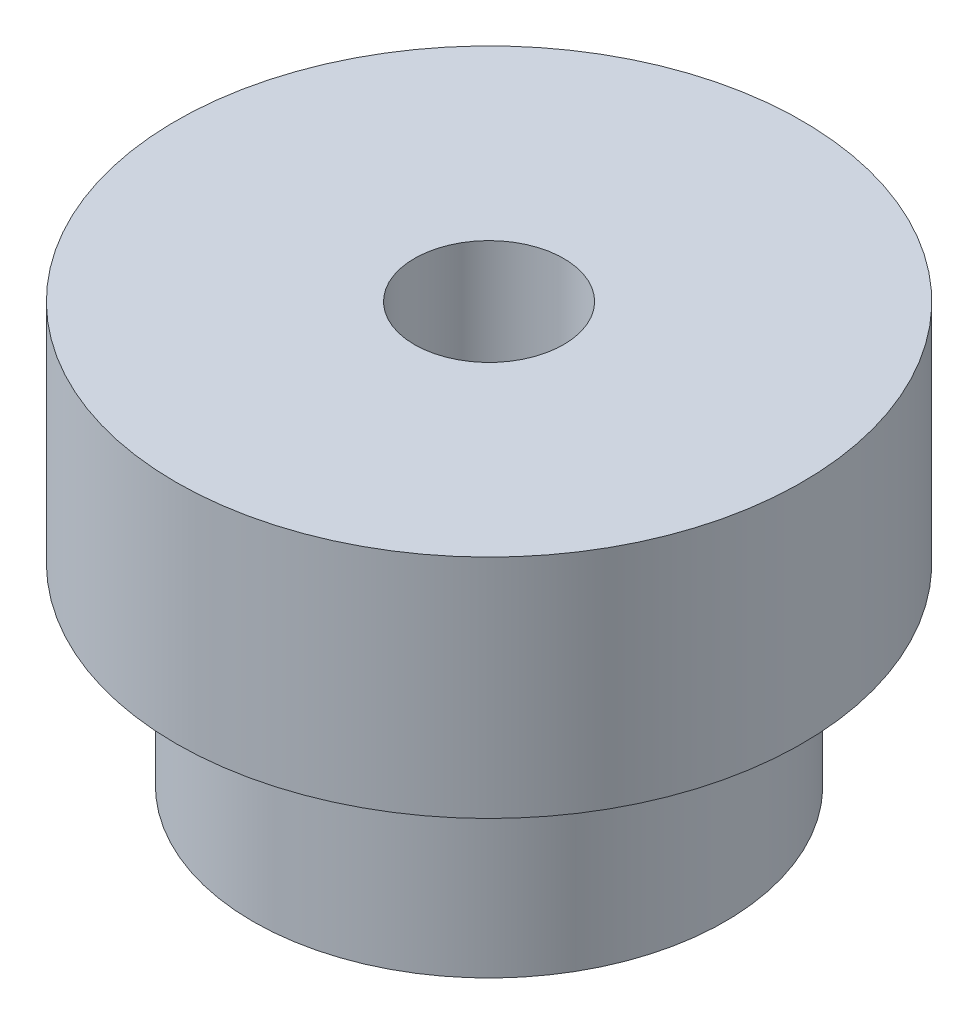
ISO-10303-21;
HEADER;
FILE_DESCRIPTION(('STEP AP214'),'2;1');
FILE_NAME('part.step','',(''),(''),'','','');
FILE_SCHEMA(('AUTOMOTIVE_DESIGN { 1 0 10303 214 1 1 1 1 }'));
ENDSEC;
DATA;
#1=APPLICATION_CONTEXT('core data for automotive mechanical design processes');
#2=APPLICATION_PROTOCOL_DEFINITION('international standard','automotive_design',2000,#1);
#3=PRODUCT_CONTEXT('',#1,'mechanical');
#4=PRODUCT('Part','Part','',(#3));
#5=PRODUCT_RELATED_PRODUCT_CATEGORY('part','',(#4));
#6=PRODUCT_DEFINITION_FORMATION('','',#4);
#7=PRODUCT_DEFINITION_CONTEXT('part definition',#1,'design');
#8=PRODUCT_DEFINITION('design','',#6,#7);
#9=PRODUCT_DEFINITION_SHAPE('','',#8);
#10=(LENGTH_UNIT() NAMED_UNIT(*) SI_UNIT(.MILLI.,.METRE.));
#11=(NAMED_UNIT(*) PLANE_ANGLE_UNIT() SI_UNIT($,.RADIAN.));
#12=(NAMED_UNIT(*) SI_UNIT($,.STERADIAN.) SOLID_ANGLE_UNIT());
#13=UNCERTAINTY_MEASURE_WITH_UNIT(LENGTH_MEASURE(1.E-05),#10,'distance_accuracy_value','');
#14=(GEOMETRIC_REPRESENTATION_CONTEXT(3) GLOBAL_UNCERTAINTY_ASSIGNED_CONTEXT((#13)) GLOBAL_UNIT_ASSIGNED_CONTEXT((#10,
#11,#12)) REPRESENTATION_CONTEXT('',''));
#15=CARTESIAN_POINT('',(0.,0.,0.));
#16=DIRECTION('',(0.,0.,1.));
#17=DIRECTION('',(1.,0.,0.));
#18=AXIS2_PLACEMENT_3D('',#15,#16,#17);
#19=CARTESIAN_POINT('',(0.,10.16,0.));
#20=DIRECTION('',(0.,-1.,0.));
#21=DIRECTION('',(0.,0.,-1.));
#22=AXIS2_PLACEMENT_3D('',#19,#20,#21);
#23=CYLINDRICAL_SURFACE('',#22,12.446);
#24=CARTESIAN_POINT('',(0.,10.16,0.));
#25=DIRECTION('',(0.,1.,0.));
#26=DIRECTION('',(0.,0.,1.));
#27=AXIS2_PLACEMENT_3D('',#24,#25,#26);
#28=CIRCLE('',#27,12.446);
#29=CARTESIAN_POINT('',(0.,10.16,12.446));
#30=VERTEX_POINT('',#29);
#31=EDGE_CURVE('E10',#30,#30,#28,.T.);
#32=ORIENTED_EDGE('',*,*,#31,.F.);
#33=EDGE_LOOP('',(#32));
#34=FACE_BOUND('',#33,.T.);
#35=CARTESIAN_POINT('',(0.,0.,0.));
#36=DIRECTION('',(0.,1.,0.));
#37=DIRECTION('',(0.,0.,1.));
#38=AXIS2_PLACEMENT_3D('',#35,#36,#37);
#39=CIRCLE('',#38,12.446);
#40=CARTESIAN_POINT('',(0.,0.,12.446));
#41=VERTEX_POINT('',#40);
#42=EDGE_CURVE('E46',#41,#41,#39,.T.);
#43=ORIENTED_EDGE('',*,*,#42,.T.);
#44=EDGE_LOOP('',(#43));
#45=FACE_BOUND('',#44,.T.);
#46=ADVANCED_FACE('F43',(#34,#45),#23,.T.);
#47=CARTESIAN_POINT('',(0.,0.,0.));
#48=DIRECTION('',(0.,1.,0.));
#49=DIRECTION('',(0.,0.,1.));
#50=AXIS2_PLACEMENT_3D('',#47,#48,#49);
#51=PLANE('',#50);
#52=CARTESIAN_POINT('',(0.,0.,0.));
#53=DIRECTION('',(0.,1.,0.));
#54=DIRECTION('',(0.,0.,1.));
#55=AXIS2_PLACEMENT_3D('',#52,#53,#54);
#56=CIRCLE('',#55,3.937);
#57=CARTESIAN_POINT('',(0.,0.,3.937));
#58=VERTEX_POINT('',#57);
#59=EDGE_CURVE('E62',#58,#58,#56,.T.);
#60=ORIENTED_EDGE('',*,*,#59,.T.);
#61=EDGE_LOOP('',(#60));
#62=FACE_BOUND('',#61,.T.);
#63=ORIENTED_EDGE('',*,*,#42,.F.);
#64=EDGE_LOOP('',(#63));
#65=FACE_BOUND('',#64,.T.);
#66=ADVANCED_FACE('F73',(#62,#65),#51,.F.);
#67=CARTESIAN_POINT('',(0.,22.098,0.));
#68=DIRECTION('',(0.,-1.,0.));
#69=DIRECTION('',(0.,0.,-1.));
#70=AXIS2_PLACEMENT_3D('',#67,#68,#69);
#71=CYLINDRICAL_SURFACE('',#70,16.51);
#72=CARTESIAN_POINT('',(0.,22.098,0.));
#73=DIRECTION('',(0.,1.,0.));
#74=DIRECTION('',(0.,0.,1.));
#75=AXIS2_PLACEMENT_3D('',#72,#73,#74);
#76=CIRCLE('',#75,16.51);
#77=CARTESIAN_POINT('',(0.,22.098,16.51));
#78=VERTEX_POINT('',#77);
#79=EDGE_CURVE('E57',#78,#78,#76,.T.);
#80=ORIENTED_EDGE('',*,*,#79,.F.);
#81=EDGE_LOOP('',(#80));
#82=FACE_BOUND('',#81,.T.);
#83=CARTESIAN_POINT('',(0.,10.16,0.));
#84=DIRECTION('',(0.,1.,0.));
#85=DIRECTION('',(0.,0.,1.));
#86=AXIS2_PLACEMENT_3D('',#83,#84,#85);
#87=CIRCLE('',#86,16.51);
#88=CARTESIAN_POINT('',(0.,10.16,16.51));
#89=VERTEX_POINT('',#88);
#90=EDGE_CURVE('E59',#89,#89,#87,.T.);
#91=ORIENTED_EDGE('',*,*,#90,.T.);
#92=EDGE_LOOP('',(#91));
#93=FACE_BOUND('',#92,.T.);
#94=ADVANCED_FACE('F86',(#82,#93),#71,.T.);
#95=CARTESIAN_POINT('',(0.,22.098,0.));
#96=DIRECTION('',(0.,1.,0.));
#97=DIRECTION('',(0.,0.,1.));
#98=AXIS2_PLACEMENT_3D('',#95,#96,#97);
#99=PLANE('',#98);
#100=CARTESIAN_POINT('',(0.,22.098,0.));
#101=DIRECTION('',(0.,1.,0.));
#102=DIRECTION('',(0.,0.,1.));
#103=AXIS2_PLACEMENT_3D('',#100,#101,#102);
#104=CIRCLE('',#103,3.937);
#105=CARTESIAN_POINT('',(0.,22.098,3.937));
#106=VERTEX_POINT('',#105);
#107=EDGE_CURVE('E66',#106,#106,#104,.T.);
#108=ORIENTED_EDGE('',*,*,#107,.F.);
#109=EDGE_LOOP('',(#108));
#110=FACE_BOUND('',#109,.T.);
#111=ORIENTED_EDGE('',*,*,#79,.T.);
#112=EDGE_LOOP('',(#111));
#113=FACE_BOUND('',#112,.T.);
#114=ADVANCED_FACE('F83',(#110,#113),#99,.T.);
#115=CARTESIAN_POINT('',(0.,10.16,0.));
#116=DIRECTION('',(0.,1.,0.));
#117=DIRECTION('',(0.,0.,1.));
#118=AXIS2_PLACEMENT_3D('',#115,#116,#117);
#119=PLANE('',#118);
#120=ORIENTED_EDGE('',*,*,#31,.T.);
#121=EDGE_LOOP('',(#120));
#122=FACE_BOUND('',#121,.T.);
#123=ORIENTED_EDGE('',*,*,#90,.F.);
#124=EDGE_LOOP('',(#123));
#125=FACE_BOUND('',#124,.T.);
#126=ADVANCED_FACE('F79',(#122,#125),#119,.F.);
#127=CARTESIAN_POINT('',(0.,0.,0.));
#128=DIRECTION('',(0.,1.,0.));
#129=DIRECTION('',(0.,0.,1.));
#130=AXIS2_PLACEMENT_3D('',#127,#128,#129);
#131=CYLINDRICAL_SURFACE('',#130,3.937);
#132=ORIENTED_EDGE('',*,*,#59,.F.);
#133=EDGE_LOOP('',(#132));
#134=FACE_BOUND('',#133,.T.);
#135=ORIENTED_EDGE('',*,*,#107,.T.);
#136=EDGE_LOOP('',(#135));
#137=FACE_BOUND('',#136,.T.);
#138=ADVANCED_FACE('F76',(#134,#137),#131,.F.);
#139=CLOSED_SHELL('',(#46,#66,#94,#114,#126,#138));
#140=MANIFOLD_SOLID_BREP('B2',#139);
#141=ADVANCED_BREP_SHAPE_REPRESENTATION('',(#18,#140),#14);
#142=SHAPE_DEFINITION_REPRESENTATION(#9,#141);
ENDSEC;
END-ISO-10303-21;
